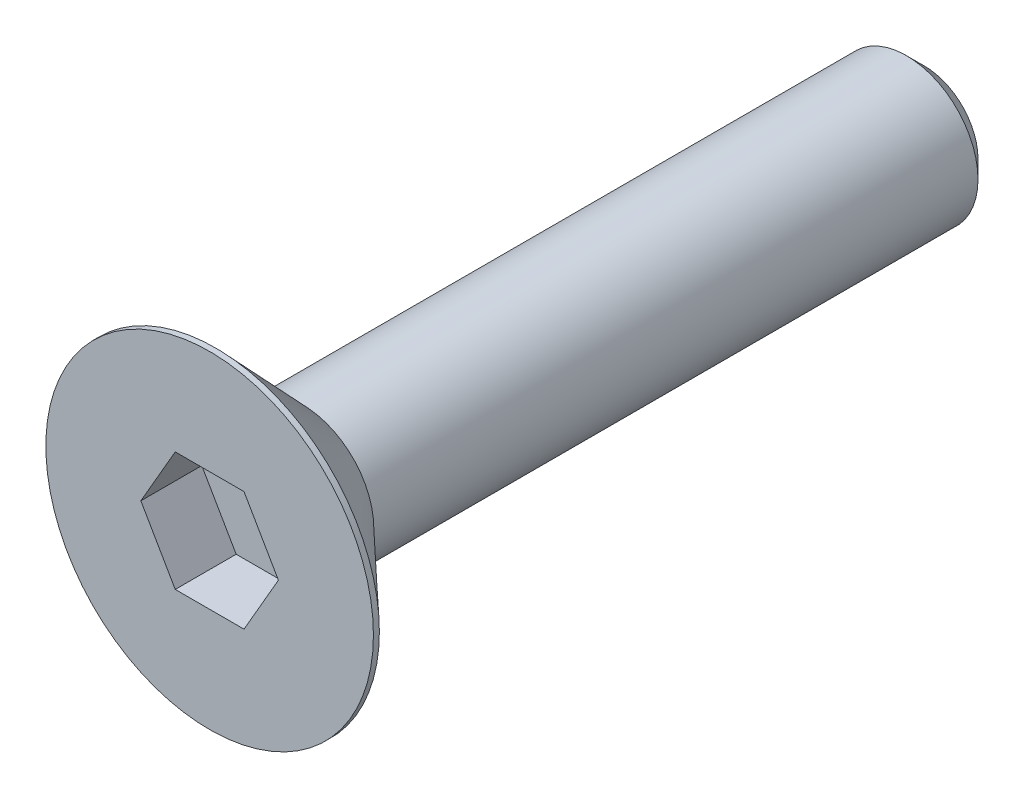
ISO-10303-21;
HEADER;
FILE_DESCRIPTION(('STEP AP214'),'2;1');
FILE_NAME('part.step','',(''),(''),'','','');
FILE_SCHEMA(('AUTOMOTIVE_DESIGN { 1 0 10303 214 1 1 1 1 }'));
ENDSEC;
DATA;
#1=APPLICATION_CONTEXT('core data for automotive mechanical design processes');
#2=APPLICATION_PROTOCOL_DEFINITION('international standard','automotive_design',2000,#1);
#3=PRODUCT_CONTEXT('',#1,'mechanical');
#4=PRODUCT('Part','Part','',(#3));
#5=PRODUCT_RELATED_PRODUCT_CATEGORY('part','',(#4));
#6=PRODUCT_DEFINITION_FORMATION('','',#4);
#7=PRODUCT_DEFINITION_CONTEXT('part definition',#1,'design');
#8=PRODUCT_DEFINITION('design','',#6,#7);
#9=PRODUCT_DEFINITION_SHAPE('','',#8);
#10=(LENGTH_UNIT() NAMED_UNIT(*) SI_UNIT(.MILLI.,.METRE.));
#11=(NAMED_UNIT(*) PLANE_ANGLE_UNIT() SI_UNIT($,.RADIAN.));
#12=(NAMED_UNIT(*) SI_UNIT($,.STERADIAN.) SOLID_ANGLE_UNIT());
#13=UNCERTAINTY_MEASURE_WITH_UNIT(LENGTH_MEASURE(1.E-05),#10,'distance_accuracy_value','');
#14=(GEOMETRIC_REPRESENTATION_CONTEXT(3) GLOBAL_UNCERTAINTY_ASSIGNED_CONTEXT((#13)) GLOBAL_UNIT_ASSIGNED_CONTEXT((#10,
#11,#12)) REPRESENTATION_CONTEXT('',''));
#15=CARTESIAN_POINT('',(0.,0.,0.));
#16=DIRECTION('',(0.,0.,1.));
#17=DIRECTION('',(1.,0.,0.));
#18=AXIS2_PLACEMENT_3D('',#15,#16,#17);
#19=CARTESIAN_POINT('',(0.,0.,-12.));
#20=DIRECTION('',(0.,0.,-1.));
#21=DIRECTION('',(-1.,0.,0.));
#22=AXIS2_PLACEMENT_3D('',#19,#20,#21);
#23=PLANE('',#22);
#24=CARTESIAN_POINT('',(0.,0.,-12.));
#25=DIRECTION('',(0.,0.,-1.));
#26=DIRECTION('',(-1.,0.,0.));
#27=AXIS2_PLACEMENT_3D('',#24,#25,#26);
#28=CIRCLE('',#27,0.899999999999996);
#29=CARTESIAN_POINT('',(0.899999999999997,0.,-12.));
#30=VERTEX_POINT('',#29);
#31=EDGE_CURVE('E154',#30,#30,#28,.T.);
#32=ORIENTED_EDGE('',*,*,#31,.T.);
#33=EDGE_LOOP('',(#32));
#34=FACE_BOUND('',#33,.T.);
#35=ADVANCED_FACE('F40',(#34),#23,.T.);
#36=CARTESIAN_POINT('',(0.,0.,10.123));
#37=DIRECTION('',(0.,0.,1.));
#38=DIRECTION('',(1.,0.,0.));
#39=AXIS2_PLACEMENT_3D('',#36,#37,#38);
#40=CYLINDRICAL_SURFACE('',#39,1.2);
#41=CARTESIAN_POINT('',(0.,0.,-1.5560606060606));
#42=DIRECTION('',(0.,0.,1.));
#43=DIRECTION('',(1.,0.,0.));
#44=AXIS2_PLACEMENT_3D('',#41,#42,#43);
#45=CIRCLE('',#44,1.2);
#46=CARTESIAN_POINT('',(1.2,0.,-1.5560606060606));
#47=VERTEX_POINT('',#46);
#48=EDGE_CURVE('E11',#47,#47,#45,.F.);
#49=CARTESIAN_POINT('',(0.,0.,-11.7));
#50=DIRECTION('',(0.,0.,-1.));
#51=DIRECTION('',(-1.,0.,0.));
#52=AXIS2_PLACEMENT_3D('',#49,#50,#51);
#53=CIRCLE('',#52,1.2);
#54=CARTESIAN_POINT('',(1.2,0.,-11.7));
#55=VERTEX_POINT('',#54);
#56=EDGE_CURVE('E151',#55,#55,#53,.F.);
#57=CARTESIAN_POINT('',(1.2,0.,-1.5560606060606));
#58=CARTESIAN_POINT('',(1.2,0.,-1.66172664141413));
#59=CARTESIAN_POINT('',(1.2,0.,-1.76739267676767));
#60=CARTESIAN_POINT('',(1.2,0.,-1.97872474747474));
#61=CARTESIAN_POINT('',(1.2,0.,-2.08439078282827));
#62=CARTESIAN_POINT('',(1.2,0.,-2.29572285353534));
#63=CARTESIAN_POINT('',(1.2,0.,-2.40138888888888));
#64=CARTESIAN_POINT('',(1.2,0.,-2.61272095959595));
#65=CARTESIAN_POINT('',(1.2,0.,-2.71838699494948));
#66=CARTESIAN_POINT('',(1.2,0.,-2.92971906565656));
#67=CARTESIAN_POINT('',(1.2,0.,-3.03538510101009));
#68=CARTESIAN_POINT('',(1.2,0.,-3.24671717171716));
#69=CARTESIAN_POINT('',(1.2,0.,-3.3523832070707));
#70=CARTESIAN_POINT('',(1.2,0.,-3.56371527777777));
#71=CARTESIAN_POINT('',(1.2,0.,-3.6693813131313));
#72=CARTESIAN_POINT('',(1.2,0.,-3.88071338383837));
#73=CARTESIAN_POINT('',(1.2,0.,-3.98637941919191));
#74=CARTESIAN_POINT('',(1.2,0.,-4.19771148989898));
#75=CARTESIAN_POINT('',(1.2,0.,-4.30337752525252));
#76=CARTESIAN_POINT('',(1.2,0.,-4.51470959595959));
#77=CARTESIAN_POINT('',(1.2,0.,-4.62037563131312));
#78=CARTESIAN_POINT('',(1.2,0.,-4.83170770202019));
#79=CARTESIAN_POINT('',(1.2,0.,-4.93737373737373));
#80=CARTESIAN_POINT('',(1.2,0.,-5.1487058080808));
#81=CARTESIAN_POINT('',(1.2,0.,-5.25437184343433));
#82=CARTESIAN_POINT('',(1.2,0.,-5.46570391414141));
#83=CARTESIAN_POINT('',(1.2,0.,-5.57136994949494));
#84=CARTESIAN_POINT('',(1.2,0.,-5.78270202020201));
#85=CARTESIAN_POINT('',(1.2,0.,-5.88836805555555));
#86=CARTESIAN_POINT('',(1.2,0.,-6.09970012626262));
#87=CARTESIAN_POINT('',(1.2,0.,-6.20536616161615));
#88=CARTESIAN_POINT('',(1.2,0.,-6.41669823232322));
#89=CARTESIAN_POINT('',(1.2,0.,-6.52236426767676));
#90=CARTESIAN_POINT('',(1.2,0.,-6.73369633838383));
#91=CARTESIAN_POINT('',(1.2,0.,-6.83936237373737));
#92=CARTESIAN_POINT('',(1.2,0.,-7.05069444444444));
#93=CARTESIAN_POINT('',(1.2,0.,-7.15636047979797));
#94=CARTESIAN_POINT('',(1.2,0.,-7.36769255050504));
#95=CARTESIAN_POINT('',(1.2,0.,-7.47335858585858));
#96=CARTESIAN_POINT('',(1.2,0.,-7.68469065656565));
#97=CARTESIAN_POINT('',(1.2,0.,-7.79035669191918));
#98=CARTESIAN_POINT('',(1.2,0.,-8.00168876262626));
#99=CARTESIAN_POINT('',(1.2,0.,-8.10735479797979));
#100=CARTESIAN_POINT('',(1.2,0.,-8.31868686868686));
#101=CARTESIAN_POINT('',(1.2,0.,-8.4243529040404));
#102=CARTESIAN_POINT('',(1.2,0.,-8.63568497474747));
#103=CARTESIAN_POINT('',(1.2,0.,-8.741351010101));
#104=CARTESIAN_POINT('',(1.2,0.,-8.95268308080807));
#105=CARTESIAN_POINT('',(1.2,0.,-9.05834911616161));
#106=CARTESIAN_POINT('',(1.2,0.,-9.26968118686868));
#107=CARTESIAN_POINT('',(1.2,0.,-9.37534722222222));
#108=CARTESIAN_POINT('',(1.2,0.,-9.58667929292929));
#109=CARTESIAN_POINT('',(1.2,0.,-9.69234532828282));
#110=CARTESIAN_POINT('',(1.2,0.,-9.9036773989899));
#111=CARTESIAN_POINT('',(1.2,0.,-10.0093434343434));
#112=CARTESIAN_POINT('',(1.2,0.,-10.2206755050505));
#113=CARTESIAN_POINT('',(1.2,0.,-10.326341540404));
#114=CARTESIAN_POINT('',(1.2,0.,-10.5376736111111));
#115=CARTESIAN_POINT('',(1.2,0.,-10.6433396464646));
#116=CARTESIAN_POINT('',(1.2,0.,-10.8546717171717));
#117=CARTESIAN_POINT('',(1.2,0.,-10.9603377525252));
#118=CARTESIAN_POINT('',(1.2,0.,-11.1716698232323));
#119=CARTESIAN_POINT('',(1.2,0.,-11.2773358585859));
#120=CARTESIAN_POINT('',(1.2,0.,-11.4886679292929));
#121=CARTESIAN_POINT('',(1.2,0.,-11.5943339646465));
#122=CARTESIAN_POINT('',(1.2,0.,-11.7));
#123=B_SPLINE_CURVE_WITH_KNOTS('',3,(#57,#58,#59,#60,#61,#62,#63,#64,#65,#66,#67,#68,#69,#70,
#71,#72,#73,#74,#75,#76,#77,#78,#79,#80,#81,#82,#83,#84,#85,#86,#87,#88,#89,#90,#91,#92,#93,#94,
#95,#96,#97,#98,#99,#100,#101,#102,#103,#104,#105,#106,#107,#108,#109,#110,#111,#112,#113,#114,
#115,#116,#117,#118,#119,#120,#121,#122),.UNSPECIFIED.,.F.,.F.,(4,2,2,2,2,2,2,2,2,2,2,2,2,2,2,2,
2,2,2,2,2,2,2,2,2,2,2,2,2,2,2,2,4),(0.,0.316998106060607,0.633996212121212,0.950994318181818,
1.26799242424242,1.58499053030303,1.90198863636364,2.21898674242424,2.53598484848485,
2.85298295454546,3.16998106060606,3.48697916666667,3.80397727272727,4.12097537878788,
4.43797348484849,4.75497159090909,5.0719696969697,5.38896780303031,5.70596590909091,
6.02296401515152,6.33996212121212,6.65696022727273,6.97395833333334,7.29095643939394,
7.60795454545455,7.92495265151516,8.24195075757576,8.55894886363637,8.87594696969697,
9.19294507575758,9.50994318181819,9.82694128787879,10.1439393939394),.UNSPECIFIED.);
#124=EDGE_CURVE('BSEAM176',#47,#55,#123,.T.);
#125=ORIENTED_EDGE('',*,*,#48,.T.);
#126=ORIENTED_EDGE('',*,*,#56,.T.);
#127=ORIENTED_EDGE('',*,*,#124,.T.);
#128=ORIENTED_EDGE('',*,*,#124,.F.);
#129=EDGE_LOOP('',(#125,#127,#126,#128));
#130=FACE_BOUND('',#129,.T.);
#131=ADVANCED_FACE('F176',(#130),#40,.T.);
#132=CARTESIAN_POINT('',(0.,0.,10.123));
#133=DIRECTION('',(0.,0.,1.));
#134=DIRECTION('',(1.,0.,0.));
#135=AXIS2_PLACEMENT_3D('',#132,#133,#134);
#136=CYLINDRICAL_SURFACE('',#135,2.75);
#137=CARTESIAN_POINT('',(0.,0.,-0.099999999999989));
#138=DIRECTION('',(0.,0.,-1.));
#139=DIRECTION('',(-1.,0.,0.));
#140=AXIS2_PLACEMENT_3D('',#137,#138,#139);
#141=CIRCLE('',#140,2.75);
#142=CARTESIAN_POINT('',(2.75,0.,-0.099999999999989));
#143=VERTEX_POINT('',#142);
#144=EDGE_CURVE('E49',#143,#143,#141,.F.);
#145=ORIENTED_EDGE('',*,*,#144,.T.);
#146=EDGE_LOOP('',(#145));
#147=FACE_BOUND('',#146,.T.);
#148=CARTESIAN_POINT('',(0.,0.,0.));
#149=DIRECTION('',(0.,0.,1.));
#150=DIRECTION('',(1.,0.,0.));
#151=AXIS2_PLACEMENT_3D('',#148,#149,#150);
#152=CIRCLE('',#151,2.75);
#153=CARTESIAN_POINT('',(2.75,0.,0.));
#154=VERTEX_POINT('',#153);
#155=EDGE_CURVE('E143',#154,#154,#152,.T.);
#156=ORIENTED_EDGE('',*,*,#155,.F.);
#157=EDGE_LOOP('',(#156));
#158=FACE_BOUND('',#157,.T.);
#159=ADVANCED_FACE('F159',(#147,#158),#136,.T.);
#160=CARTESIAN_POINT('',(2.75,0.,0.));
#161=DIRECTION('',(0.,0.,1.));
#162=DIRECTION('',(1.,0.,0.));
#163=AXIS2_PLACEMENT_3D('',#160,#161,#162);
#164=PLANE('',#163);
#165=DIRECTION('',(0.499999999999995,0.866025403784441,0.));
#166=VECTOR('',#165,1.);
#167=CARTESIAN_POINT('',(0.577350269189637,-0.999999999999993,0.));
#168=LINE('',#167,#166);
#169=CARTESIAN_POINT('',(0.577350269189637,-0.999999999999993,0.));
#170=VERTEX_POINT('',#169);
#171=CARTESIAN_POINT('',(1.15470053837925,0.,0.));
#172=VERTEX_POINT('',#171);
#173=EDGE_CURVE('E56',#170,#172,#168,.T.);
#174=ORIENTED_EDGE('',*,*,#173,.F.);
#175=DIRECTION('',(1.,0.,0.));
#176=VECTOR('',#175,1.);
#177=CARTESIAN_POINT('',(-0.577350269189617,-1.00000000000001,0.));
#178=LINE('',#177,#176);
#179=CARTESIAN_POINT('',(-0.577350269189617,-1.00000000000001,0.));
#180=VERTEX_POINT('',#179);
#181=EDGE_CURVE('E139',#180,#170,#178,.T.);
#182=ORIENTED_EDGE('',*,*,#181,.F.);
#183=DIRECTION('',(0.500000000000007,-0.866025403784434,0.));
#184=VECTOR('',#183,1.);
#185=CARTESIAN_POINT('',(-1.15470053837925,0.,0.));
#186=LINE('',#185,#184);
#187=CARTESIAN_POINT('',(-1.15470053837925,0.,0.));
#188=VERTEX_POINT('',#187);
#189=EDGE_CURVE('E137',#188,#180,#186,.T.);
#190=ORIENTED_EDGE('',*,*,#189,.F.);
#191=DIRECTION('',(-0.499999999999995,-0.866025403784442,0.));
#192=VECTOR('',#191,1.);
#193=CARTESIAN_POINT('',(-0.57735026918963,0.999999999999998,0.));
#194=LINE('',#193,#192);
#195=CARTESIAN_POINT('',(-0.57735026918963,0.999999999999998,0.));
#196=VERTEX_POINT('',#195);
#197=EDGE_CURVE('E104',#196,#188,#194,.T.);
#198=ORIENTED_EDGE('',*,*,#197,.F.);
#199=DIRECTION('',(-1.,0.,0.));
#200=VECTOR('',#199,1.);
#201=CARTESIAN_POINT('',(0.577350269189624,1.,0.));
#202=LINE('',#201,#200);
#203=CARTESIAN_POINT('',(0.577350269189624,1.,0.));
#204=VERTEX_POINT('',#203);
#205=EDGE_CURVE('E133',#204,#196,#202,.T.);
#206=ORIENTED_EDGE('',*,*,#205,.F.);
#207=DIRECTION('',(-0.500000000000001,0.866025403784438,0.));
#208=VECTOR('',#207,1.);
#209=CARTESIAN_POINT('',(1.15470053837925,0.,0.));
#210=LINE('',#209,#208);
#211=EDGE_CURVE('E130',#172,#204,#210,.T.);
#212=ORIENTED_EDGE('',*,*,#211,.F.);
#213=EDGE_LOOP('',(#174,#182,#190,#198,#206,#212));
#214=FACE_BOUND('',#213,.T.);
#215=ORIENTED_EDGE('',*,*,#155,.T.);
#216=EDGE_LOOP('',(#215));
#217=FACE_BOUND('',#216,.T.);
#218=ADVANCED_FACE('F172',(#214,#217),#164,.T.);
#219=CARTESIAN_POINT('',(0.,0.,-11.7));
#220=DIRECTION('',(0.,0.,1.));
#221=DIRECTION('',(1.,0.,0.));
#222=AXIS2_PLACEMENT_3D('',#219,#220,#221);
#223=CONICAL_SURFACE('',#222,1.2,0.785398163397446);
#224=CARTESIAN_POINT('',(0.899999999999997,0.,-12.));
#225=CARTESIAN_POINT('',(0.903124999999997,0.,-11.996875));
#226=CARTESIAN_POINT('',(0.906249999999997,0.,-11.99375));
#227=CARTESIAN_POINT('',(0.912499999999997,0.,-11.9875));
#228=CARTESIAN_POINT('',(0.915624999999997,0.,-11.984375));
#229=CARTESIAN_POINT('',(0.921874999999997,0.,-11.978125));
#230=CARTESIAN_POINT('',(0.924999999999997,0.,-11.975));
#231=CARTESIAN_POINT('',(0.931249999999997,0.,-11.96875));
#232=CARTESIAN_POINT('',(0.934374999999998,0.,-11.965625));
#233=CARTESIAN_POINT('',(0.940624999999998,0.,-11.959375));
#234=CARTESIAN_POINT('',(0.943749999999998,0.,-11.95625));
#235=CARTESIAN_POINT('',(0.949999999999998,0.,-11.95));
#236=CARTESIAN_POINT('',(0.953124999999997,0.,-11.946875));
#237=CARTESIAN_POINT('',(0.959374999999998,0.,-11.940625));
#238=CARTESIAN_POINT('',(0.962499999999998,0.,-11.9375));
#239=CARTESIAN_POINT('',(0.968749999999998,0.,-11.93125));
#240=CARTESIAN_POINT('',(0.971874999999998,0.,-11.928125));
#241=CARTESIAN_POINT('',(0.978124999999998,0.,-11.921875));
#242=CARTESIAN_POINT('',(0.981249999999998,0.,-11.91875));
#243=CARTESIAN_POINT('',(0.987499999999998,0.,-11.9125));
#244=CARTESIAN_POINT('',(0.990624999999998,0.,-11.909375));
#245=CARTESIAN_POINT('',(0.996874999999999,0.,-11.903125));
#246=CARTESIAN_POINT('',(0.999999999999999,0.,-11.9));
#247=CARTESIAN_POINT('',(1.00625,0.,-11.89375));
#248=CARTESIAN_POINT('',(1.009375,0.,-11.890625));
#249=CARTESIAN_POINT('',(1.015625,0.,-11.884375));
#250=CARTESIAN_POINT('',(1.01875,0.,-11.88125));
#251=CARTESIAN_POINT('',(1.025,0.,-11.875));
#252=CARTESIAN_POINT('',(1.028125,0.,-11.871875));
#253=CARTESIAN_POINT('',(1.034375,0.,-11.865625));
#254=CARTESIAN_POINT('',(1.0375,0.,-11.8625));
#255=CARTESIAN_POINT('',(1.04375,0.,-11.85625));
#256=CARTESIAN_POINT('',(1.046875,0.,-11.853125));
#257=CARTESIAN_POINT('',(1.053125,0.,-11.846875));
#258=CARTESIAN_POINT('',(1.05625,0.,-11.84375));
#259=CARTESIAN_POINT('',(1.0625,0.,-11.8375));
#260=CARTESIAN_POINT('',(1.065625,0.,-11.834375));
#261=CARTESIAN_POINT('',(1.071875,0.,-11.828125));
#262=CARTESIAN_POINT('',(1.075,0.,-11.825));
#263=CARTESIAN_POINT('',(1.08125,0.,-11.81875));
#264=CARTESIAN_POINT('',(1.084375,0.,-11.815625));
#265=CARTESIAN_POINT('',(1.090625,0.,-11.809375));
#266=CARTESIAN_POINT('',(1.09375,0.,-11.80625));
#267=CARTESIAN_POINT('',(1.1,0.,-11.8));
#268=CARTESIAN_POINT('',(1.103125,0.,-11.796875));
#269=CARTESIAN_POINT('',(1.109375,0.,-11.790625));
#270=CARTESIAN_POINT('',(1.1125,0.,-11.7875));
#271=CARTESIAN_POINT('',(1.11875,0.,-11.78125));
#272=CARTESIAN_POINT('',(1.121875,0.,-11.778125));
#273=CARTESIAN_POINT('',(1.128125,0.,-11.771875));
#274=CARTESIAN_POINT('',(1.13125,0.,-11.76875));
#275=CARTESIAN_POINT('',(1.1375,0.,-11.7625));
#276=CARTESIAN_POINT('',(1.140625,0.,-11.759375));
#277=CARTESIAN_POINT('',(1.146875,0.,-11.753125));
#278=CARTESIAN_POINT('',(1.15,0.,-11.75));
#279=CARTESIAN_POINT('',(1.15625,0.,-11.74375));
#280=CARTESIAN_POINT('',(1.159375,0.,-11.740625));
#281=CARTESIAN_POINT('',(1.165625,0.,-11.734375));
#282=CARTESIAN_POINT('',(1.16875,0.,-11.73125));
#283=CARTESIAN_POINT('',(1.175,0.,-11.725));
#284=CARTESIAN_POINT('',(1.178125,0.,-11.721875));
#285=CARTESIAN_POINT('',(1.184375,0.,-11.715625));
#286=CARTESIAN_POINT('',(1.1875,0.,-11.7125));
#287=CARTESIAN_POINT('',(1.19375,0.,-11.70625));
#288=CARTESIAN_POINT('',(1.196875,0.,-11.703125));
#289=CARTESIAN_POINT('',(1.2,0.,-11.7));
#290=B_SPLINE_CURVE_WITH_KNOTS('',3,(#224,#225,#226,#227,#228,#229,#230,#231,#232,#233,#234,
#235,#236,#237,#238,#239,#240,#241,#242,#243,#244,#245,#246,#247,#248,#249,#250,#251,#252,#253,
#254,#255,#256,#257,#258,#259,#260,#261,#262,#263,#264,#265,#266,#267,#268,#269,#270,#271,#272,
#273,#274,#275,#276,#277,#278,#279,#280,#281,#282,#283,#284,#285,#286,#287,#288,#289),
.UNSPECIFIED.,.F.,.F.,(4,2,2,2,2,2,2,2,2,2,2,2,2,2,2,2,2,2,2,2,2,2,2,2,2,2,2,2,2,2,2,2,4),(0.,
0.0132582521472471,0.0265165042944954,0.0397747564417438,0.0530330085889909,0.0662912607362392,
0.0795495128834876,0.0928077650307347,0.106066017177983,0.119324269325231,0.132582521472479,
0.145840773619727,0.159099025766975,0.172357277914222,0.185615530061471,0.198873782208719,
0.212132034355967,0.225390286503214,0.238648538650463,0.251906790797711,0.265165042944958,
0.278423295092207,0.291681547239455,0.304939799386702,0.31819805153395,0.331456303681199,
0.344714555828446,0.357972807975694,0.371231060122942,0.38448931227019,0.397747564417438,
0.411005816564686,0.424264068711933),.UNSPECIFIED.);
#291=EDGE_CURVE('BSEAM164',#30,#55,#290,.T.);
#292=ORIENTED_EDGE('',*,*,#31,.F.);
#293=ORIENTED_EDGE('',*,*,#56,.F.);
#294=ORIENTED_EDGE('',*,*,#291,.T.);
#295=ORIENTED_EDGE('',*,*,#291,.F.);
#296=EDGE_LOOP('',(#292,#294,#293,#295));
#297=FACE_BOUND('',#296,.T.);
#298=ADVANCED_FACE('F164',(#297),#223,.T.);
#299=CARTESIAN_POINT('',(0.,0.,-0.099999999999989));
#300=DIRECTION('',(0.,0.,1.));
#301=DIRECTION('',(1.,0.,0.));
#302=AXIS2_PLACEMENT_3D('',#299,#300,#301);
#303=CONICAL_SURFACE('',#302,2.75,0.816637996827716);
#304=CARTESIAN_POINT('',(1.2,0.,-1.5560606060606));
#305=CARTESIAN_POINT('',(1.21614583333333,0.,-1.5408933080808));
#306=CARTESIAN_POINT('',(1.23229166666667,0.,-1.525726010101));
#307=CARTESIAN_POINT('',(1.26458333333333,0.,-1.4953914141414));
#308=CARTESIAN_POINT('',(1.28072916666667,0.,-1.48022411616161));
#309=CARTESIAN_POINT('',(1.31302083333333,0.,-1.44988952020201));
#310=CARTESIAN_POINT('',(1.32916666666667,0.,-1.43472222222221));
#311=CARTESIAN_POINT('',(1.36145833333333,0.,-1.40438762626262));
#312=CARTESIAN_POINT('',(1.37760416666667,0.,-1.38922032828282));
#313=CARTESIAN_POINT('',(1.40989583333333,0.,-1.35888573232322));
#314=CARTESIAN_POINT('',(1.42604166666667,0.,-1.34371843434342));
#315=CARTESIAN_POINT('',(1.45833333333333,0.,-1.31338383838383));
#316=CARTESIAN_POINT('',(1.47447916666667,0.,-1.29821654040403));
#317=CARTESIAN_POINT('',(1.50677083333333,0.,-1.26788194444443));
#318=CARTESIAN_POINT('',(1.52291666666667,0.,-1.25271464646464));
#319=CARTESIAN_POINT('',(1.55520833333333,0.,-1.22238005050504));
#320=CARTESIAN_POINT('',(1.57135416666667,0.,-1.20721275252524));
#321=CARTESIAN_POINT('',(1.60364583333333,0.,-1.17687815656565));
#322=CARTESIAN_POINT('',(1.61979166666667,0.,-1.16171085858585));
#323=CARTESIAN_POINT('',(1.65208333333333,0.,-1.13137626262625));
#324=CARTESIAN_POINT('',(1.66822916666667,0.,-1.11620896464645));
#325=CARTESIAN_POINT('',(1.70052083333333,0.,-1.08587436868686));
#326=CARTESIAN_POINT('',(1.71666666666667,0.,-1.07070707070706));
#327=CARTESIAN_POINT('',(1.74895833333333,0.,-1.04037247474746));
#328=CARTESIAN_POINT('',(1.76510416666667,0.,-1.02520517676767));
#329=CARTESIAN_POINT('',(1.79739583333333,0.,-0.99487058080807));
#330=CARTESIAN_POINT('',(1.81354166666667,0.,-0.979703282828272));
#331=CARTESIAN_POINT('',(1.84583333333333,0.,-0.949368686868676));
#332=CARTESIAN_POINT('',(1.86197916666667,0.,-0.934201388888878));
#333=CARTESIAN_POINT('',(1.89427083333333,0.,-0.903866792929282));
#334=CARTESIAN_POINT('',(1.91041666666667,0.,-0.888699494949484));
#335=CARTESIAN_POINT('',(1.94270833333333,0.,-0.858364898989888));
#336=CARTESIAN_POINT('',(1.95885416666667,0.,-0.84319760101009));
#337=CARTESIAN_POINT('',(1.99114583333333,0.,-0.812863005050494));
#338=CARTESIAN_POINT('',(2.00729166666667,0.,-0.797695707070696));
#339=CARTESIAN_POINT('',(2.03958333333333,0.,-0.767361111111101));
#340=CARTESIAN_POINT('',(2.05572916666667,0.,-0.752193813131303));
#341=CARTESIAN_POINT('',(2.08802083333333,0.,-0.721859217171706));
#342=CARTESIAN_POINT('',(2.10416666666667,0.,-0.706691919191909));
#343=CARTESIAN_POINT('',(2.13645833333333,0.,-0.676357323232312));
#344=CARTESIAN_POINT('',(2.15260416666667,0.,-0.661190025252514));
#345=CARTESIAN_POINT('',(2.18489583333333,0.,-0.630855429292918));
#346=CARTESIAN_POINT('',(2.20104166666667,0.,-0.615688131313121));
#347=CARTESIAN_POINT('',(2.23333333333333,0.,-0.585353535353525));
#348=CARTESIAN_POINT('',(2.24947916666667,0.,-0.570186237373727));
#349=CARTESIAN_POINT('',(2.28177083333333,0.,-0.539851641414131));
#350=CARTESIAN_POINT('',(2.29791666666667,0.,-0.524684343434333));
#351=CARTESIAN_POINT('',(2.33020833333333,0.,-0.494349747474737));
#352=CARTESIAN_POINT('',(2.34635416666667,0.,-0.479182449494939));
#353=CARTESIAN_POINT('',(2.37864583333333,0.,-0.448847853535343));
#354=CARTESIAN_POINT('',(2.39479166666667,0.,-0.433680555555545));
#355=CARTESIAN_POINT('',(2.42708333333333,0.,-0.403345959595949));
#356=CARTESIAN_POINT('',(2.44322916666667,0.,-0.388178661616151));
#357=CARTESIAN_POINT('',(2.47552083333333,0.,-0.357844065656555));
#358=CARTESIAN_POINT('',(2.49166666666667,0.,-0.342676767676757));
#359=CARTESIAN_POINT('',(2.52395833333333,0.,-0.312342171717161));
#360=CARTESIAN_POINT('',(2.54010416666667,0.,-0.297174873737363));
#361=CARTESIAN_POINT('',(2.57239583333333,0.,-0.266840277777767));
#362=CARTESIAN_POINT('',(2.58854166666667,0.,-0.251672979797969));
#363=CARTESIAN_POINT('',(2.62083333333333,0.,-0.221338383838373));
#364=CARTESIAN_POINT('',(2.63697916666667,0.,-0.206171085858575));
#365=CARTESIAN_POINT('',(2.66927083333333,0.,-0.175836489898979));
#366=CARTESIAN_POINT('',(2.68541666666667,0.,-0.160669191919181));
#367=CARTESIAN_POINT('',(2.71770833333333,0.,-0.130334595959585));
#368=CARTESIAN_POINT('',(2.73385416666667,0.,-0.115167297979787));
#369=CARTESIAN_POINT('',(2.75,0.,-0.099999999999989));
#370=B_SPLINE_CURVE_WITH_KNOTS('',3,(#304,#305,#306,#307,#308,#309,#310,#311,#312,#313,#314,
#315,#316,#317,#318,#319,#320,#321,#322,#323,#324,#325,#326,#327,#328,#329,#330,#331,#332,#333,
#334,#335,#336,#337,#338,#339,#340,#341,#342,#343,#344,#345,#346,#347,#348,#349,#350,#351,#352,
#353,#354,#355,#356,#357,#358,#359,#360,#361,#362,#363,#364,#365,#366,#367,#368,#369),
.UNSPECIFIED.,.F.,.F.,(4,2,2,2,2,2,2,2,2,2,2,2,2,2,2,2,2,2,2,2,2,2,2,2,2,2,2,2,2,2,2,2,4),(0.,
0.0664576087315957,0.132915217463191,0.199372826194787,0.265830434926382,0.332288043657978,
0.398745652389574,0.46520326112117,0.531660869852765,0.598118478584361,0.664576087315956,
0.731033696047552,0.797491304779148,0.863948913510743,0.930406522242339,0.996864130973934,
1.06332173970553,1.12977934843713,1.19623695716872,1.26269456590032,1.32915217463191,
1.39560978336351,1.4620673920951,1.5285250008267,1.5949826095583,1.66144021828989,
1.72789782702149,1.79435543575308,1.86081304448468,1.92727065321627,1.99372826194787,
2.06018587067946,2.12664347941106),.UNSPECIFIED.);
#371=EDGE_CURVE('BSEAM43',#47,#143,#370,.T.);
#372=ORIENTED_EDGE('',*,*,#48,.F.);
#373=ORIENTED_EDGE('',*,*,#144,.F.);
#374=ORIENTED_EDGE('',*,*,#371,.T.);
#375=ORIENTED_EDGE('',*,*,#371,.F.);
#376=EDGE_LOOP('',(#372,#374,#373,#375));
#377=FACE_BOUND('',#376,.T.);
#378=ADVANCED_FACE('F43',(#377),#303,.T.);
#379=CARTESIAN_POINT('',(0.577350269189637,-0.999999999999993,-1.023));
#380=DIRECTION('',(0.866025403784442,-0.499999999999995,0.));
#381=DIRECTION('',(0.499999999999995,0.866025403784442,0.));
#382=AXIS2_PLACEMENT_3D('',#379,#380,#381);
#383=PLANE('',#382);
#384=ORIENTED_EDGE('',*,*,#173,.T.);
#385=DIRECTION('',(0.,0.,1.));
#386=VECTOR('',#385,1.);
#387=CARTESIAN_POINT('',(1.15470053837925,0.,-1.023));
#388=LINE('',#387,#386);
#389=CARTESIAN_POINT('',(1.15470053837925,0.,-1.023));
#390=VERTEX_POINT('',#389);
#391=EDGE_CURVE('E86',#390,#172,#388,.T.);
#392=ORIENTED_EDGE('',*,*,#391,.F.);
#393=DIRECTION('',(0.499999999999995,0.866025403784441,0.));
#394=VECTOR('',#393,1.);
#395=CARTESIAN_POINT('',(0.577350269189637,-0.999999999999993,-1.023));
#396=LINE('',#395,#394);
#397=CARTESIAN_POINT('',(0.577350269189637,-0.999999999999993,-1.023));
#398=VERTEX_POINT('',#397);
#399=EDGE_CURVE('E141',#398,#390,#396,.T.);
#400=ORIENTED_EDGE('',*,*,#399,.F.);
#401=DIRECTION('',(0.,0.,1.));
#402=VECTOR('',#401,1.);
#403=CARTESIAN_POINT('',(0.577350269189637,-0.999999999999993,-1.023));
#404=LINE('',#403,#402);
#405=EDGE_CURVE('E64',#398,#170,#404,.T.);
#406=ORIENTED_EDGE('',*,*,#405,.T.);
#407=EDGE_LOOP('',(#384,#392,#400,#406));
#408=FACE_BOUND('',#407,.T.);
#409=ADVANCED_FACE('F163',(#408),#383,.F.);
#410=CARTESIAN_POINT('',(-0.577350269189617,-1.00000000000001,-1.023));
#411=DIRECTION('',(0.,-1.,0.));
#412=DIRECTION('',(1.,0.,0.));
#413=AXIS2_PLACEMENT_3D('',#410,#411,#412);
#414=PLANE('',#413);
#415=ORIENTED_EDGE('',*,*,#181,.T.);
#416=ORIENTED_EDGE('',*,*,#405,.F.);
#417=DIRECTION('',(1.,0.,0.));
#418=VECTOR('',#417,1.);
#419=CARTESIAN_POINT('',(-0.577350269189617,-1.00000000000001,-1.023));
#420=LINE('',#419,#418);
#421=CARTESIAN_POINT('',(-0.577350269189617,-1.00000000000001,-1.023));
#422=VERTEX_POINT('',#421);
#423=EDGE_CURVE('E116',#422,#398,#420,.T.);
#424=ORIENTED_EDGE('',*,*,#423,.F.);
#425=DIRECTION('',(0.,0.,1.));
#426=VECTOR('',#425,1.);
#427=CARTESIAN_POINT('',(-0.577350269189617,-1.00000000000001,-1.023));
#428=LINE('',#427,#426);
#429=EDGE_CURVE('E108',#422,#180,#428,.T.);
#430=ORIENTED_EDGE('',*,*,#429,.T.);
#431=EDGE_LOOP('',(#415,#416,#424,#430));
#432=FACE_BOUND('',#431,.T.);
#433=ADVANCED_FACE('F170',(#432),#414,.F.);
#434=CARTESIAN_POINT('',(-1.15470053837925,0.,-1.023));
#435=DIRECTION('',(-0.866025403784435,-0.500000000000007,0.));
#436=DIRECTION('',(0.500000000000007,-0.866025403784435,0.));
#437=AXIS2_PLACEMENT_3D('',#434,#435,#436);
#438=PLANE('',#437);
#439=ORIENTED_EDGE('',*,*,#189,.T.);
#440=ORIENTED_EDGE('',*,*,#429,.F.);
#441=DIRECTION('',(0.500000000000007,-0.866025403784434,0.));
#442=VECTOR('',#441,1.);
#443=CARTESIAN_POINT('',(-1.15470053837925,0.,-1.023));
#444=LINE('',#443,#442);
#445=CARTESIAN_POINT('',(-1.15470053837925,0.,-1.023));
#446=VERTEX_POINT('',#445);
#447=EDGE_CURVE('E112',#446,#422,#444,.T.);
#448=ORIENTED_EDGE('',*,*,#447,.F.);
#449=DIRECTION('',(0.,0.,1.));
#450=VECTOR('',#449,1.);
#451=CARTESIAN_POINT('',(-1.15470053837925,0.,-1.023));
#452=LINE('',#451,#450);
#453=EDGE_CURVE('E97',#446,#188,#452,.T.);
#454=ORIENTED_EDGE('',*,*,#453,.T.);
#455=EDGE_LOOP('',(#439,#440,#448,#454));
#456=FACE_BOUND('',#455,.T.);
#457=ADVANCED_FACE('F113',(#456),#438,.F.);
#458=CARTESIAN_POINT('',(-0.57735026918963,0.999999999999998,-1.023));
#459=DIRECTION('',(-0.866025403784442,0.499999999999995,0.));
#460=DIRECTION('',(-0.499999999999995,-0.866025403784442,0.));
#461=AXIS2_PLACEMENT_3D('',#458,#459,#460);
#462=PLANE('',#461);
#463=ORIENTED_EDGE('',*,*,#197,.T.);
#464=ORIENTED_EDGE('',*,*,#453,.F.);
#465=DIRECTION('',(-0.499999999999995,-0.866025403784442,0.));
#466=VECTOR('',#465,1.);
#467=CARTESIAN_POINT('',(-0.57735026918963,0.999999999999998,-1.023));
#468=LINE('',#467,#466);
#469=CARTESIAN_POINT('',(-0.57735026918963,0.999999999999998,-1.023));
#470=VERTEX_POINT('',#469);
#471=EDGE_CURVE('E101',#470,#446,#468,.T.);
#472=ORIENTED_EDGE('',*,*,#471,.F.);
#473=DIRECTION('',(0.,0.,1.));
#474=VECTOR('',#473,1.);
#475=CARTESIAN_POINT('',(-0.57735026918963,0.999999999999998,-1.023));
#476=LINE('',#475,#474);
#477=EDGE_CURVE('E109',#470,#196,#476,.T.);
#478=ORIENTED_EDGE('',*,*,#477,.T.);
#479=EDGE_LOOP('',(#463,#464,#472,#478));
#480=FACE_BOUND('',#479,.T.);
#481=ADVANCED_FACE('F99',(#480),#462,.F.);
#482=CARTESIAN_POINT('',(0.577350269189624,1.,-1.023));
#483=DIRECTION('',(0.,1.,0.));
#484=DIRECTION('',(-1.,0.,0.));
#485=AXIS2_PLACEMENT_3D('',#482,#483,#484);
#486=PLANE('',#485);
#487=ORIENTED_EDGE('',*,*,#205,.T.);
#488=ORIENTED_EDGE('',*,*,#477,.F.);
#489=DIRECTION('',(-1.,0.,0.));
#490=VECTOR('',#489,1.);
#491=CARTESIAN_POINT('',(0.577350269189624,1.,-1.023));
#492=LINE('',#491,#490);
#493=CARTESIAN_POINT('',(0.577350269189624,1.,-1.023));
#494=VERTEX_POINT('',#493);
#495=EDGE_CURVE('E122',#494,#470,#492,.T.);
#496=ORIENTED_EDGE('',*,*,#495,.F.);
#497=DIRECTION('',(0.,0.,1.));
#498=VECTOR('',#497,1.);
#499=CARTESIAN_POINT('',(0.577350269189624,1.,-1.023));
#500=LINE('',#499,#498);
#501=EDGE_CURVE('E146',#494,#204,#500,.T.);
#502=ORIENTED_EDGE('',*,*,#501,.T.);
#503=EDGE_LOOP('',(#487,#488,#496,#502));
#504=FACE_BOUND('',#503,.T.);
#505=ADVANCED_FACE('F198',(#504),#486,.F.);
#506=CARTESIAN_POINT('',(1.15470053837925,0.,-1.023));
#507=DIRECTION('',(0.866025403784438,0.500000000000001,0.));
#508=DIRECTION('',(-0.500000000000001,0.866025403784438,0.));
#509=AXIS2_PLACEMENT_3D('',#506,#507,#508);
#510=PLANE('',#509);
#511=ORIENTED_EDGE('',*,*,#211,.T.);
#512=ORIENTED_EDGE('',*,*,#501,.F.);
#513=DIRECTION('',(-0.500000000000001,0.866025403784438,0.));
#514=VECTOR('',#513,1.);
#515=CARTESIAN_POINT('',(1.15470053837925,0.,-1.023));
#516=LINE('',#515,#514);
#517=EDGE_CURVE('E124',#390,#494,#516,.T.);
#518=ORIENTED_EDGE('',*,*,#517,.F.);
#519=ORIENTED_EDGE('',*,*,#391,.T.);
#520=EDGE_LOOP('',(#511,#512,#518,#519));
#521=FACE_BOUND('',#520,.T.);
#522=ADVANCED_FACE('F195',(#521),#510,.F.);
#523=CARTESIAN_POINT('',(0.,0.,-1.023));
#524=DIRECTION('',(0.,0.,1.));
#525=DIRECTION('',(1.,0.,0.));
#526=AXIS2_PLACEMENT_3D('',#523,#524,#525);
#527=PLANE('',#526);
#528=ORIENTED_EDGE('',*,*,#399,.T.);
#529=ORIENTED_EDGE('',*,*,#517,.T.);
#530=ORIENTED_EDGE('',*,*,#495,.T.);
#531=ORIENTED_EDGE('',*,*,#471,.T.);
#532=ORIENTED_EDGE('',*,*,#447,.T.);
#533=ORIENTED_EDGE('',*,*,#423,.T.);
#534=EDGE_LOOP('',(#528,#529,#530,#531,#532,#533));
#535=FACE_BOUND('',#534,.T.);
#536=ADVANCED_FACE('F119',(#535),#527,.T.);
#537=CLOSED_SHELL('',(#35,#131,#159,#218,#298,#378,#409,#433,#457,#481,#505,#522,#536));
#538=MANIFOLD_SOLID_BREP('B2',#537);
#539=ADVANCED_BREP_SHAPE_REPRESENTATION('',(#18,#538),#14);
#540=SHAPE_DEFINITION_REPRESENTATION(#9,#539);
ENDSEC;
END-ISO-10303-21;
